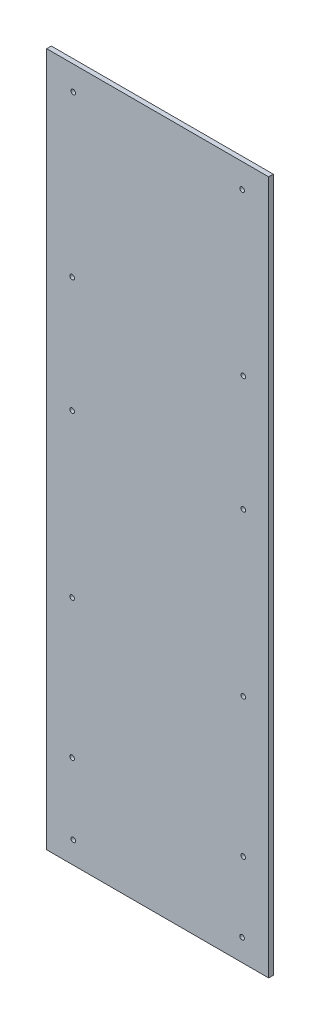
ISO-10303-21;
HEADER;
FILE_DESCRIPTION(('STEP AP214'),'2;1');
FILE_NAME('part.step','',(''),(''),'','','');
FILE_SCHEMA(('AUTOMOTIVE_DESIGN { 1 0 10303 214 1 1 1 1 }'));
ENDSEC;
DATA;
#1=APPLICATION_CONTEXT('core data for automotive mechanical design processes');
#2=APPLICATION_PROTOCOL_DEFINITION('international standard','automotive_design',2000,#1);
#3=PRODUCT_CONTEXT('',#1,'mechanical');
#4=PRODUCT('Part','Part','',(#3));
#5=PRODUCT_RELATED_PRODUCT_CATEGORY('part','',(#4));
#6=PRODUCT_DEFINITION_FORMATION('','',#4);
#7=PRODUCT_DEFINITION_CONTEXT('part definition',#1,'design');
#8=PRODUCT_DEFINITION('design','',#6,#7);
#9=PRODUCT_DEFINITION_SHAPE('','',#8);
#10=(LENGTH_UNIT() NAMED_UNIT(*) SI_UNIT(.MILLI.,.METRE.));
#11=(NAMED_UNIT(*) PLANE_ANGLE_UNIT() SI_UNIT($,.RADIAN.));
#12=(NAMED_UNIT(*) SI_UNIT($,.STERADIAN.) SOLID_ANGLE_UNIT());
#13=UNCERTAINTY_MEASURE_WITH_UNIT(LENGTH_MEASURE(1.E-05),#10,'distance_accuracy_value','');
#14=(GEOMETRIC_REPRESENTATION_CONTEXT(3) GLOBAL_UNCERTAINTY_ASSIGNED_CONTEXT((#13)) GLOBAL_UNIT_ASSIGNED_CONTEXT((#10,
#11,#12)) REPRESENTATION_CONTEXT('',''));
#15=CARTESIAN_POINT('',(0.,0.,0.));
#16=DIRECTION('',(0.,0.,1.));
#17=DIRECTION('',(1.,0.,0.));
#18=AXIS2_PLACEMENT_3D('',#15,#16,#17);
#19=CARTESIAN_POINT('',(-48.,-150.,2.));
#20=DIRECTION('',(1.,0.,0.));
#21=DIRECTION('',(0.,0.,-1.));
#22=AXIS2_PLACEMENT_3D('',#19,#20,#21);
#23=PLANE('',#22);
#24=DIRECTION('',(0.,-1.,0.));
#25=VECTOR('',#24,1.);
#26=CARTESIAN_POINT('',(-48.,-150.,0.));
#27=LINE('',#26,#25);
#28=CARTESIAN_POINT('',(-48.,150.,0.));
#29=VERTEX_POINT('',#28);
#30=CARTESIAN_POINT('',(-48.,-150.,0.));
#31=VERTEX_POINT('',#30);
#32=EDGE_CURVE('E99',#29,#31,#27,.T.);
#33=ORIENTED_EDGE('',*,*,#32,.T.);
#34=DIRECTION('',(0.,0.,-1.));
#35=VECTOR('',#34,1.);
#36=CARTESIAN_POINT('',(-48.,-150.,2.));
#37=LINE('',#36,#35);
#38=CARTESIAN_POINT('',(-48.,-150.,2.));
#39=VERTEX_POINT('',#38);
#40=EDGE_CURVE('E11',#39,#31,#37,.T.);
#41=ORIENTED_EDGE('',*,*,#40,.F.);
#42=DIRECTION('',(0.,-1.,0.));
#43=VECTOR('',#42,1.);
#44=CARTESIAN_POINT('',(-48.,-150.,2.));
#45=LINE('',#44,#43);
#46=CARTESIAN_POINT('',(-48.,150.,2.));
#47=VERTEX_POINT('',#46);
#48=EDGE_CURVE('E86',#47,#39,#45,.T.);
#49=ORIENTED_EDGE('',*,*,#48,.F.);
#50=DIRECTION('',(0.,0.,-1.));
#51=VECTOR('',#50,1.);
#52=CARTESIAN_POINT('',(-48.,150.,2.));
#53=LINE('',#52,#51);
#54=EDGE_CURVE('E95',#47,#29,#53,.T.);
#55=ORIENTED_EDGE('',*,*,#54,.T.);
#56=EDGE_LOOP('',(#33,#41,#49,#55));
#57=FACE_BOUND('',#56,.T.);
#58=ADVANCED_FACE('F33',(#57),#23,.F.);
#59=CARTESIAN_POINT('',(48.,-150.,2.));
#60=DIRECTION('',(0.,1.,0.));
#61=DIRECTION('',(0.,0.,1.));
#62=AXIS2_PLACEMENT_3D('',#59,#60,#61);
#63=PLANE('',#62);
#64=DIRECTION('',(1.,0.,0.));
#65=VECTOR('',#64,1.);
#66=CARTESIAN_POINT('',(48.,-150.,0.));
#67=LINE('',#66,#65);
#68=CARTESIAN_POINT('',(48.,-150.,0.));
#69=VERTEX_POINT('',#68);
#70=EDGE_CURVE('E90',#31,#69,#67,.T.);
#71=ORIENTED_EDGE('',*,*,#70,.T.);
#72=DIRECTION('',(0.,0.,-1.));
#73=VECTOR('',#72,1.);
#74=CARTESIAN_POINT('',(48.,-150.,2.));
#75=LINE('',#74,#73);
#76=CARTESIAN_POINT('',(48.,-150.,2.));
#77=VERTEX_POINT('',#76);
#78=EDGE_CURVE('E42',#77,#69,#75,.T.);
#79=ORIENTED_EDGE('',*,*,#78,.F.);
#80=DIRECTION('',(1.,0.,0.));
#81=VECTOR('',#80,1.);
#82=CARTESIAN_POINT('',(48.,-150.,2.));
#83=LINE('',#82,#81);
#84=EDGE_CURVE('E81',#39,#77,#83,.T.);
#85=ORIENTED_EDGE('',*,*,#84,.F.);
#86=ORIENTED_EDGE('',*,*,#40,.T.);
#87=EDGE_LOOP('',(#71,#79,#85,#86));
#88=FACE_BOUND('',#87,.T.);
#89=ADVANCED_FACE('F89',(#88),#63,.F.);
#90=CARTESIAN_POINT('',(48.,-150.,2.));
#91=DIRECTION('',(-1.,0.,0.));
#92=DIRECTION('',(0.,0.,1.));
#93=AXIS2_PLACEMENT_3D('',#90,#91,#92);
#94=PLANE('',#93);
#95=DIRECTION('',(0.,1.,0.));
#96=VECTOR('',#95,1.);
#97=CARTESIAN_POINT('',(48.,-150.,0.));
#98=LINE('',#97,#96);
#99=CARTESIAN_POINT('',(48.,150.,0.));
#100=VERTEX_POINT('',#99);
#101=EDGE_CURVE('E68',#69,#100,#98,.T.);
#102=ORIENTED_EDGE('',*,*,#101,.T.);
#103=DIRECTION('',(0.,0.,-1.));
#104=VECTOR('',#103,1.);
#105=CARTESIAN_POINT('',(48.,150.,2.));
#106=LINE('',#105,#104);
#107=CARTESIAN_POINT('',(48.,150.,2.));
#108=VERTEX_POINT('',#107);
#109=EDGE_CURVE('E91',#108,#100,#106,.T.);
#110=ORIENTED_EDGE('',*,*,#109,.F.);
#111=DIRECTION('',(0.,1.,0.));
#112=VECTOR('',#111,1.);
#113=CARTESIAN_POINT('',(48.,-150.,2.));
#114=LINE('',#113,#112);
#115=EDGE_CURVE('E84',#77,#108,#114,.T.);
#116=ORIENTED_EDGE('',*,*,#115,.F.);
#117=ORIENTED_EDGE('',*,*,#78,.T.);
#118=EDGE_LOOP('',(#102,#110,#116,#117));
#119=FACE_BOUND('',#118,.T.);
#120=ADVANCED_FACE('F93',(#119),#94,.F.);
#121=CARTESIAN_POINT('',(48.,150.,2.));
#122=DIRECTION('',(0.,-1.,0.));
#123=DIRECTION('',(1.,0.,0.));
#124=AXIS2_PLACEMENT_3D('',#121,#122,#123);
#125=PLANE('',#124);
#126=DIRECTION('',(-1.,0.,0.));
#127=VECTOR('',#126,1.);
#128=CARTESIAN_POINT('',(48.,150.,0.));
#129=LINE('',#128,#127);
#130=EDGE_CURVE('E74',#100,#29,#129,.T.);
#131=ORIENTED_EDGE('',*,*,#130,.T.);
#132=ORIENTED_EDGE('',*,*,#54,.F.);
#133=DIRECTION('',(-1.,0.,0.));
#134=VECTOR('',#133,1.);
#135=CARTESIAN_POINT('',(48.,150.,2.));
#136=LINE('',#135,#134);
#137=EDGE_CURVE('E51',#108,#47,#136,.T.);
#138=ORIENTED_EDGE('',*,*,#137,.F.);
#139=ORIENTED_EDGE('',*,*,#109,.T.);
#140=EDGE_LOOP('',(#131,#132,#138,#139));
#141=FACE_BOUND('',#140,.T.);
#142=ADVANCED_FACE('F176',(#141),#125,.F.);
#143=CARTESIAN_POINT('',(0.,0.,2.));
#144=DIRECTION('',(0.,0.,1.));
#145=DIRECTION('',(1.,0.,0.));
#146=AXIS2_PLACEMENT_3D('',#143,#144,#145);
#147=PLANE('',#146);
#148=CARTESIAN_POINT('',(36.5,139.5,2.));
#149=DIRECTION('',(0.,0.,1.));
#150=DIRECTION('',(1.,0.,0.));
#151=AXIS2_PLACEMENT_3D('',#148,#149,#150);
#152=CIRCLE('',#151,0.999999999999998);
#153=CARTESIAN_POINT('',(37.5,139.5,2.));
#154=VERTEX_POINT('',#153);
#155=EDGE_CURVE('E337',#154,#154,#152,.T.);
#156=ORIENTED_EDGE('',*,*,#155,.F.);
#157=EDGE_LOOP('',(#156));
#158=FACE_BOUND('',#157,.T.);
#159=CARTESIAN_POINT('',(-36.5,-140.5,2.));
#160=DIRECTION('',(0.,0.,1.));
#161=DIRECTION('',(1.,0.,0.));
#162=AXIS2_PLACEMENT_3D('',#159,#160,#161);
#163=CIRCLE('',#162,0.999999999999998);
#164=CARTESIAN_POINT('',(-35.5,-140.5,2.));
#165=VERTEX_POINT('',#164);
#166=EDGE_CURVE('E338',#165,#165,#163,.T.);
#167=ORIENTED_EDGE('',*,*,#166,.F.);
#168=EDGE_LOOP('',(#167));
#169=FACE_BOUND('',#168,.T.);
#170=CARTESIAN_POINT('',(36.5,-140.5,2.));
#171=DIRECTION('',(0.,0.,1.));
#172=DIRECTION('',(1.,0.,0.));
#173=AXIS2_PLACEMENT_3D('',#170,#171,#172);
#174=CIRCLE('',#173,0.999999999999998);
#175=CARTESIAN_POINT('',(37.5,-140.5,2.));
#176=VERTEX_POINT('',#175);
#177=EDGE_CURVE('E343',#176,#176,#174,.T.);
#178=ORIENTED_EDGE('',*,*,#177,.F.);
#179=EDGE_LOOP('',(#178));
#180=FACE_BOUND('',#179,.T.);
#181=CARTESIAN_POINT('',(-36.5,139.5,2.));
#182=DIRECTION('',(0.,0.,1.));
#183=DIRECTION('',(1.,0.,0.));
#184=AXIS2_PLACEMENT_3D('',#181,#182,#183);
#185=CIRCLE('',#184,0.999999999999998);
#186=CARTESIAN_POINT('',(-35.5,139.5,2.));
#187=VERTEX_POINT('',#186);
#188=EDGE_CURVE('E136',#187,#187,#185,.T.);
#189=ORIENTED_EDGE('',*,*,#188,.F.);
#190=EDGE_LOOP('',(#189));
#191=FACE_BOUND('',#190,.T.);
#192=CARTESIAN_POINT('',(-37.,-50.,2.));
#193=DIRECTION('',(0.,0.,1.));
#194=DIRECTION('',(1.,0.,0.));
#195=AXIS2_PLACEMENT_3D('',#192,#193,#194);
#196=CIRCLE('',#195,0.999999999999998);
#197=CARTESIAN_POINT('',(-36.,-50.,2.));
#198=VERTEX_POINT('',#197);
#199=EDGE_CURVE('E160',#198,#198,#196,.T.);
#200=ORIENTED_EDGE('',*,*,#199,.F.);
#201=EDGE_LOOP('',(#200));
#202=FACE_BOUND('',#201,.T.);
#203=CARTESIAN_POINT('',(37.,70.,2.));
#204=DIRECTION('',(0.,0.,1.));
#205=DIRECTION('',(-1.,0.,0.));
#206=AXIS2_PLACEMENT_3D('',#203,#204,#205);
#207=CIRCLE('',#206,0.999999999999998);
#208=CARTESIAN_POINT('',(36.,70.,2.));
#209=VERTEX_POINT('',#208);
#210=EDGE_CURVE('E156',#209,#209,#207,.T.);
#211=ORIENTED_EDGE('',*,*,#210,.F.);
#212=EDGE_LOOP('',(#211));
#213=FACE_BOUND('',#212,.T.);
#214=CARTESIAN_POINT('',(-37.,-110.,2.));
#215=DIRECTION('',(0.,0.,1.));
#216=DIRECTION('',(1.,0.,0.));
#217=AXIS2_PLACEMENT_3D('',#214,#215,#216);
#218=CIRCLE('',#217,0.999999999999998);
#219=CARTESIAN_POINT('',(-36.,-110.,2.));
#220=VERTEX_POINT('',#219);
#221=EDGE_CURVE('E159',#220,#220,#218,.T.);
#222=ORIENTED_EDGE('',*,*,#221,.F.);
#223=EDGE_LOOP('',(#222));
#224=FACE_BOUND('',#223,.T.);
#225=CARTESIAN_POINT('',(-37.,20.,2.));
#226=DIRECTION('',(0.,0.,1.));
#227=DIRECTION('',(1.,0.,0.));
#228=AXIS2_PLACEMENT_3D('',#225,#226,#227);
#229=CIRCLE('',#228,0.999999999999998);
#230=CARTESIAN_POINT('',(-36.,20.,2.));
#231=VERTEX_POINT('',#230);
#232=EDGE_CURVE('E163',#231,#231,#229,.T.);
#233=ORIENTED_EDGE('',*,*,#232,.F.);
#234=EDGE_LOOP('',(#233));
#235=FACE_BOUND('',#234,.T.);
#236=CARTESIAN_POINT('',(37.,20.,2.));
#237=DIRECTION('',(0.,0.,1.));
#238=DIRECTION('',(-1.,0.,0.));
#239=AXIS2_PLACEMENT_3D('',#236,#237,#238);
#240=CIRCLE('',#239,0.999999999999998);
#241=CARTESIAN_POINT('',(36.,20.,2.));
#242=VERTEX_POINT('',#241);
#243=EDGE_CURVE('E152',#242,#242,#240,.T.);
#244=ORIENTED_EDGE('',*,*,#243,.F.);
#245=EDGE_LOOP('',(#244));
#246=FACE_BOUND('',#245,.T.);
#247=CARTESIAN_POINT('',(37.,-50.,2.));
#248=DIRECTION('',(0.,0.,1.));
#249=DIRECTION('',(-1.,0.,0.));
#250=AXIS2_PLACEMENT_3D('',#247,#248,#249);
#251=CIRCLE('',#250,0.999999999999998);
#252=CARTESIAN_POINT('',(36.,-50.,2.));
#253=VERTEX_POINT('',#252);
#254=EDGE_CURVE('E147',#253,#253,#251,.T.);
#255=ORIENTED_EDGE('',*,*,#254,.F.);
#256=EDGE_LOOP('',(#255));
#257=FACE_BOUND('',#256,.T.);
#258=CARTESIAN_POINT('',(37.,-110.,2.));
#259=DIRECTION('',(0.,0.,1.));
#260=DIRECTION('',(-1.,0.,0.));
#261=AXIS2_PLACEMENT_3D('',#258,#259,#260);
#262=CIRCLE('',#261,0.999999999999998);
#263=CARTESIAN_POINT('',(36.,-110.,2.));
#264=VERTEX_POINT('',#263);
#265=EDGE_CURVE('E143',#264,#264,#262,.T.);
#266=ORIENTED_EDGE('',*,*,#265,.F.);
#267=EDGE_LOOP('',(#266));
#268=FACE_BOUND('',#267,.T.);
#269=CARTESIAN_POINT('',(-37.,70.,2.));
#270=DIRECTION('',(0.,0.,1.));
#271=DIRECTION('',(1.,0.,0.));
#272=AXIS2_PLACEMENT_3D('',#269,#270,#271);
#273=CIRCLE('',#272,0.999999999999998);
#274=CARTESIAN_POINT('',(-36.,70.,2.));
#275=VERTEX_POINT('',#274);
#276=EDGE_CURVE('E112',#275,#275,#273,.T.);
#277=ORIENTED_EDGE('',*,*,#276,.F.);
#278=EDGE_LOOP('',(#277));
#279=FACE_BOUND('',#278,.T.);
#280=ORIENTED_EDGE('',*,*,#48,.T.);
#281=ORIENTED_EDGE('',*,*,#84,.T.);
#282=ORIENTED_EDGE('',*,*,#115,.T.);
#283=ORIENTED_EDGE('',*,*,#137,.T.);
#284=EDGE_LOOP('',(#280,#281,#282,#283));
#285=FACE_BOUND('',#284,.T.);
#286=ADVANCED_FACE('F82',(#158,#169,#180,#191,#202,#213,#224,#235,#246,#257,#268,#279,#285),
#147,.T.);
#287=CARTESIAN_POINT('',(0.,0.,0.));
#288=DIRECTION('',(0.,0.,1.));
#289=DIRECTION('',(1.,0.,0.));
#290=AXIS2_PLACEMENT_3D('',#287,#288,#289);
#291=PLANE('',#290);
#292=CARTESIAN_POINT('',(36.5,139.5,0.));
#293=DIRECTION('',(0.,0.,1.));
#294=DIRECTION('',(1.,0.,0.));
#295=AXIS2_PLACEMENT_3D('',#292,#293,#294);
#296=CIRCLE('',#295,0.999999999999998);
#297=CARTESIAN_POINT('',(37.5,139.5,0.));
#298=VERTEX_POINT('',#297);
#299=EDGE_CURVE('E36',#298,#298,#296,.T.);
#300=ORIENTED_EDGE('',*,*,#299,.T.);
#301=EDGE_LOOP('',(#300));
#302=FACE_BOUND('',#301,.T.);
#303=CARTESIAN_POINT('',(-36.5,-140.5,0.));
#304=DIRECTION('',(0.,0.,1.));
#305=DIRECTION('',(1.,0.,0.));
#306=AXIS2_PLACEMENT_3D('',#303,#304,#305);
#307=CIRCLE('',#306,0.999999999999998);
#308=CARTESIAN_POINT('',(-35.5,-140.5,0.));
#309=VERTEX_POINT('',#308);
#310=EDGE_CURVE('E138',#309,#309,#307,.T.);
#311=ORIENTED_EDGE('',*,*,#310,.T.);
#312=EDGE_LOOP('',(#311));
#313=FACE_BOUND('',#312,.T.);
#314=CARTESIAN_POINT('',(36.5,-140.5,0.));
#315=DIRECTION('',(0.,0.,1.));
#316=DIRECTION('',(1.,0.,0.));
#317=AXIS2_PLACEMENT_3D('',#314,#315,#316);
#318=CIRCLE('',#317,0.999999999999998);
#319=CARTESIAN_POINT('',(37.5,-140.5,0.));
#320=VERTEX_POINT('',#319);
#321=EDGE_CURVE('E135',#320,#320,#318,.T.);
#322=ORIENTED_EDGE('',*,*,#321,.T.);
#323=EDGE_LOOP('',(#322));
#324=FACE_BOUND('',#323,.T.);
#325=CARTESIAN_POINT('',(-36.5,139.5,0.));
#326=DIRECTION('',(0.,0.,1.));
#327=DIRECTION('',(1.,0.,0.));
#328=AXIS2_PLACEMENT_3D('',#325,#326,#327);
#329=CIRCLE('',#328,0.999999999999998);
#330=CARTESIAN_POINT('',(-35.5,139.5,0.));
#331=VERTEX_POINT('',#330);
#332=EDGE_CURVE('E132',#331,#331,#329,.T.);
#333=ORIENTED_EDGE('',*,*,#332,.T.);
#334=EDGE_LOOP('',(#333));
#335=FACE_BOUND('',#334,.T.);
#336=CARTESIAN_POINT('',(-37.,-50.,0.));
#337=DIRECTION('',(0.,0.,1.));
#338=DIRECTION('',(1.,0.,0.));
#339=AXIS2_PLACEMENT_3D('',#336,#337,#338);
#340=CIRCLE('',#339,0.999999999999998);
#341=CARTESIAN_POINT('',(-36.,-50.,0.));
#342=VERTEX_POINT('',#341);
#343=EDGE_CURVE('E102',#342,#342,#340,.T.);
#344=ORIENTED_EDGE('',*,*,#343,.T.);
#345=EDGE_LOOP('',(#344));
#346=FACE_BOUND('',#345,.T.);
#347=CARTESIAN_POINT('',(37.,70.,0.));
#348=DIRECTION('',(0.,0.,1.));
#349=DIRECTION('',(1.,0.,0.));
#350=AXIS2_PLACEMENT_3D('',#347,#348,#349);
#351=CIRCLE('',#350,0.999999999999998);
#352=CARTESIAN_POINT('',(38.,70.,0.));
#353=VERTEX_POINT('',#352);
#354=EDGE_CURVE('E127',#353,#353,#351,.T.);
#355=ORIENTED_EDGE('',*,*,#354,.T.);
#356=EDGE_LOOP('',(#355));
#357=FACE_BOUND('',#356,.T.);
#358=CARTESIAN_POINT('',(-37.,-110.,0.));
#359=DIRECTION('',(0.,0.,1.));
#360=DIRECTION('',(1.,0.,0.));
#361=AXIS2_PLACEMENT_3D('',#358,#359,#360);
#362=CIRCLE('',#361,0.999999999999998);
#363=CARTESIAN_POINT('',(-36.,-110.,0.));
#364=VERTEX_POINT('',#363);
#365=EDGE_CURVE('E124',#364,#364,#362,.T.);
#366=ORIENTED_EDGE('',*,*,#365,.T.);
#367=EDGE_LOOP('',(#366));
#368=FACE_BOUND('',#367,.T.);
#369=CARTESIAN_POINT('',(-37.,20.,0.));
#370=DIRECTION('',(0.,0.,1.));
#371=DIRECTION('',(1.,0.,0.));
#372=AXIS2_PLACEMENT_3D('',#369,#370,#371);
#373=CIRCLE('',#372,0.999999999999998);
#374=CARTESIAN_POINT('',(-36.,20.,0.));
#375=VERTEX_POINT('',#374);
#376=EDGE_CURVE('E121',#375,#375,#373,.T.);
#377=ORIENTED_EDGE('',*,*,#376,.T.);
#378=EDGE_LOOP('',(#377));
#379=FACE_BOUND('',#378,.T.);
#380=CARTESIAN_POINT('',(37.,20.,0.));
#381=DIRECTION('',(0.,0.,1.));
#382=DIRECTION('',(1.,0.,0.));
#383=AXIS2_PLACEMENT_3D('',#380,#381,#382);
#384=CIRCLE('',#383,0.999999999999998);
#385=CARTESIAN_POINT('',(38.,20.,0.));
#386=VERTEX_POINT('',#385);
#387=EDGE_CURVE('E118',#386,#386,#384,.T.);
#388=ORIENTED_EDGE('',*,*,#387,.T.);
#389=EDGE_LOOP('',(#388));
#390=FACE_BOUND('',#389,.T.);
#391=CARTESIAN_POINT('',(37.,-50.,0.));
#392=DIRECTION('',(0.,0.,1.));
#393=DIRECTION('',(1.,0.,0.));
#394=AXIS2_PLACEMENT_3D('',#391,#392,#393);
#395=CIRCLE('',#394,0.999999999999998);
#396=CARTESIAN_POINT('',(38.,-50.,0.));
#397=VERTEX_POINT('',#396);
#398=EDGE_CURVE('E115',#397,#397,#395,.T.);
#399=ORIENTED_EDGE('',*,*,#398,.T.);
#400=EDGE_LOOP('',(#399));
#401=FACE_BOUND('',#400,.T.);
#402=CARTESIAN_POINT('',(37.,-110.,0.));
#403=DIRECTION('',(0.,0.,1.));
#404=DIRECTION('',(1.,0.,0.));
#405=AXIS2_PLACEMENT_3D('',#402,#403,#404);
#406=CIRCLE('',#405,0.999999999999998);
#407=CARTESIAN_POINT('',(38.,-110.,0.));
#408=VERTEX_POINT('',#407);
#409=EDGE_CURVE('E111',#408,#408,#406,.T.);
#410=ORIENTED_EDGE('',*,*,#409,.T.);
#411=EDGE_LOOP('',(#410));
#412=FACE_BOUND('',#411,.T.);
#413=CARTESIAN_POINT('',(-37.,70.,0.));
#414=DIRECTION('',(0.,0.,1.));
#415=DIRECTION('',(1.,0.,0.));
#416=AXIS2_PLACEMENT_3D('',#413,#414,#415);
#417=CIRCLE('',#416,0.999999999999998);
#418=CARTESIAN_POINT('',(-36.,70.,0.));
#419=VERTEX_POINT('',#418);
#420=EDGE_CURVE('E108',#419,#419,#417,.T.);
#421=ORIENTED_EDGE('',*,*,#420,.T.);
#422=EDGE_LOOP('',(#421));
#423=FACE_BOUND('',#422,.T.);
#424=ORIENTED_EDGE('',*,*,#32,.F.);
#425=ORIENTED_EDGE('',*,*,#130,.F.);
#426=ORIENTED_EDGE('',*,*,#101,.F.);
#427=ORIENTED_EDGE('',*,*,#70,.F.);
#428=EDGE_LOOP('',(#424,#425,#426,#427));
#429=FACE_BOUND('',#428,.T.);
#430=ADVANCED_FACE('F175',(#302,#313,#324,#335,#346,#357,#368,#379,#390,#401,#412,#423,#429),
#291,.F.);
#431=CARTESIAN_POINT('',(-37.,70.,-8.));
#432=DIRECTION('',(0.,0.,1.));
#433=DIRECTION('',(1.,0.,0.));
#434=AXIS2_PLACEMENT_3D('',#431,#432,#433);
#435=CYLINDRICAL_SURFACE('',#434,0.999999999999998);
#436=ORIENTED_EDGE('',*,*,#276,.T.);
#437=EDGE_LOOP('',(#436));
#438=FACE_BOUND('',#437,.T.);
#439=ORIENTED_EDGE('',*,*,#420,.F.);
#440=EDGE_LOOP('',(#439));
#441=FACE_BOUND('',#440,.T.);
#442=ADVANCED_FACE('F171',(#438,#441),#435,.F.);
#443=CARTESIAN_POINT('',(37.,-110.,-8.));
#444=DIRECTION('',(0.,0.,1.));
#445=DIRECTION('',(1.,0.,0.));
#446=AXIS2_PLACEMENT_3D('',#443,#444,#445);
#447=CYLINDRICAL_SURFACE('',#446,0.999999999999998);
#448=ORIENTED_EDGE('',*,*,#265,.T.);
#449=EDGE_LOOP('',(#448));
#450=FACE_BOUND('',#449,.T.);
#451=ORIENTED_EDGE('',*,*,#409,.F.);
#452=EDGE_LOOP('',(#451));
#453=FACE_BOUND('',#452,.T.);
#454=ADVANCED_FACE('F215',(#450,#453),#447,.F.);
#455=CARTESIAN_POINT('',(37.,-50.,-8.));
#456=DIRECTION('',(0.,0.,1.));
#457=DIRECTION('',(1.,0.,0.));
#458=AXIS2_PLACEMENT_3D('',#455,#456,#457);
#459=CYLINDRICAL_SURFACE('',#458,0.999999999999998);
#460=ORIENTED_EDGE('',*,*,#254,.T.);
#461=EDGE_LOOP('',(#460));
#462=FACE_BOUND('',#461,.T.);
#463=ORIENTED_EDGE('',*,*,#398,.F.);
#464=EDGE_LOOP('',(#463));
#465=FACE_BOUND('',#464,.T.);
#466=ADVANCED_FACE('F224',(#462,#465),#459,.F.);
#467=CARTESIAN_POINT('',(37.,20.,-8.));
#468=DIRECTION('',(0.,0.,1.));
#469=DIRECTION('',(1.,0.,0.));
#470=AXIS2_PLACEMENT_3D('',#467,#468,#469);
#471=CYLINDRICAL_SURFACE('',#470,0.999999999999998);
#472=ORIENTED_EDGE('',*,*,#243,.T.);
#473=EDGE_LOOP('',(#472));
#474=FACE_BOUND('',#473,.T.);
#475=ORIENTED_EDGE('',*,*,#387,.F.);
#476=EDGE_LOOP('',(#475));
#477=FACE_BOUND('',#476,.T.);
#478=ADVANCED_FACE('F233',(#474,#477),#471,.F.);
#479=CARTESIAN_POINT('',(-37.,20.,-8.));
#480=DIRECTION('',(0.,0.,1.));
#481=DIRECTION('',(1.,0.,0.));
#482=AXIS2_PLACEMENT_3D('',#479,#480,#481);
#483=CYLINDRICAL_SURFACE('',#482,0.999999999999998);
#484=ORIENTED_EDGE('',*,*,#232,.T.);
#485=EDGE_LOOP('',(#484));
#486=FACE_BOUND('',#485,.T.);
#487=ORIENTED_EDGE('',*,*,#376,.F.);
#488=EDGE_LOOP('',(#487));
#489=FACE_BOUND('',#488,.T.);
#490=ADVANCED_FACE('F243',(#486,#489),#483,.F.);
#491=CARTESIAN_POINT('',(-37.,-110.,-8.));
#492=DIRECTION('',(0.,0.,1.));
#493=DIRECTION('',(1.,0.,0.));
#494=AXIS2_PLACEMENT_3D('',#491,#492,#493);
#495=CYLINDRICAL_SURFACE('',#494,0.999999999999998);
#496=ORIENTED_EDGE('',*,*,#221,.T.);
#497=EDGE_LOOP('',(#496));
#498=FACE_BOUND('',#497,.T.);
#499=ORIENTED_EDGE('',*,*,#365,.F.);
#500=EDGE_LOOP('',(#499));
#501=FACE_BOUND('',#500,.T.);
#502=ADVANCED_FACE('F253',(#498,#501),#495,.F.);
#503=CARTESIAN_POINT('',(37.,70.,-8.));
#504=DIRECTION('',(0.,0.,1.));
#505=DIRECTION('',(1.,0.,0.));
#506=AXIS2_PLACEMENT_3D('',#503,#504,#505);
#507=CYLINDRICAL_SURFACE('',#506,0.999999999999998);
#508=ORIENTED_EDGE('',*,*,#210,.T.);
#509=EDGE_LOOP('',(#508));
#510=FACE_BOUND('',#509,.T.);
#511=ORIENTED_EDGE('',*,*,#354,.F.);
#512=EDGE_LOOP('',(#511));
#513=FACE_BOUND('',#512,.T.);
#514=ADVANCED_FACE('F263',(#510,#513),#507,.F.);
#515=CARTESIAN_POINT('',(-37.,-50.,-8.));
#516=DIRECTION('',(0.,0.,1.));
#517=DIRECTION('',(1.,0.,0.));
#518=AXIS2_PLACEMENT_3D('',#515,#516,#517);
#519=CYLINDRICAL_SURFACE('',#518,0.999999999999998);
#520=ORIENTED_EDGE('',*,*,#199,.T.);
#521=EDGE_LOOP('',(#520));
#522=FACE_BOUND('',#521,.T.);
#523=ORIENTED_EDGE('',*,*,#343,.F.);
#524=EDGE_LOOP('',(#523));
#525=FACE_BOUND('',#524,.T.);
#526=ADVANCED_FACE('F273',(#522,#525),#519,.F.);
#527=CARTESIAN_POINT('',(-36.5,139.5,-8.));
#528=DIRECTION('',(0.,0.,1.));
#529=DIRECTION('',(1.,0.,0.));
#530=AXIS2_PLACEMENT_3D('',#527,#528,#529);
#531=CYLINDRICAL_SURFACE('',#530,0.999999999999998);
#532=ORIENTED_EDGE('',*,*,#188,.T.);
#533=EDGE_LOOP('',(#532));
#534=FACE_BOUND('',#533,.T.);
#535=ORIENTED_EDGE('',*,*,#332,.F.);
#536=EDGE_LOOP('',(#535));
#537=FACE_BOUND('',#536,.T.);
#538=ADVANCED_FACE('F282',(#534,#537),#531,.F.);
#539=CARTESIAN_POINT('',(36.5,-140.5,-8.));
#540=DIRECTION('',(0.,0.,1.));
#541=DIRECTION('',(1.,0.,0.));
#542=AXIS2_PLACEMENT_3D('',#539,#540,#541);
#543=CYLINDRICAL_SURFACE('',#542,0.999999999999998);
#544=ORIENTED_EDGE('',*,*,#177,.T.);
#545=EDGE_LOOP('',(#544));
#546=FACE_BOUND('',#545,.T.);
#547=ORIENTED_EDGE('',*,*,#321,.F.);
#548=EDGE_LOOP('',(#547));
#549=FACE_BOUND('',#548,.T.);
#550=ADVANCED_FACE('F301',(#546,#549),#543,.F.);
#551=CARTESIAN_POINT('',(-36.5,-140.5,-8.));
#552=DIRECTION('',(0.,0.,1.));
#553=DIRECTION('',(1.,0.,0.));
#554=AXIS2_PLACEMENT_3D('',#551,#552,#553);
#555=CYLINDRICAL_SURFACE('',#554,0.999999999999998);
#556=ORIENTED_EDGE('',*,*,#166,.T.);
#557=EDGE_LOOP('',(#556));
#558=FACE_BOUND('',#557,.T.);
#559=ORIENTED_EDGE('',*,*,#310,.F.);
#560=EDGE_LOOP('',(#559));
#561=FACE_BOUND('',#560,.T.);
#562=ADVANCED_FACE('F311',(#558,#561),#555,.F.);
#563=CARTESIAN_POINT('',(36.5,139.5,-8.));
#564=DIRECTION('',(0.,0.,1.));
#565=DIRECTION('',(1.,0.,0.));
#566=AXIS2_PLACEMENT_3D('',#563,#564,#565);
#567=CYLINDRICAL_SURFACE('',#566,0.999999999999998);
#568=ORIENTED_EDGE('',*,*,#155,.T.);
#569=EDGE_LOOP('',(#568));
#570=FACE_BOUND('',#569,.T.);
#571=ORIENTED_EDGE('',*,*,#299,.F.);
#572=EDGE_LOOP('',(#571));
#573=FACE_BOUND('',#572,.T.);
#574=ADVANCED_FACE('F321',(#570,#573),#567,.F.);
#575=CLOSED_SHELL('',(#58,#89,#120,#142,#286,#430,#442,#454,#466,#478,#490,#502,#514,#526,#538,
#550,#562,#574));
#576=MANIFOLD_SOLID_BREP('B2',#575);
#577=ADVANCED_BREP_SHAPE_REPRESENTATION('',(#18,#576),#14);
#578=SHAPE_DEFINITION_REPRESENTATION(#9,#577);
ENDSEC;
END-ISO-10303-21;
